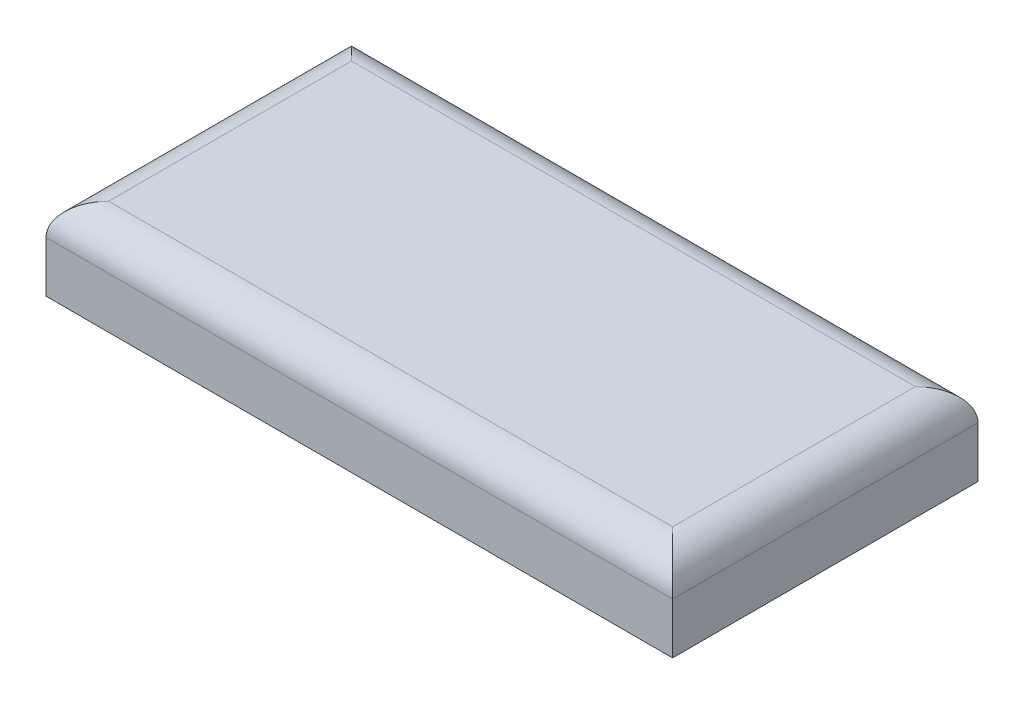
ISO-10303-21;
HEADER;
FILE_DESCRIPTION(('STEP AP214'),'2;1');
FILE_NAME('part.step','',(''),(''),'','','');
FILE_SCHEMA(('AUTOMOTIVE_DESIGN { 1 0 10303 214 1 1 1 1 }'));
ENDSEC;
DATA;
#1=APPLICATION_CONTEXT('core data for automotive mechanical design processes');
#2=APPLICATION_PROTOCOL_DEFINITION('international standard','automotive_design',2000,#1);
#3=PRODUCT_CONTEXT('',#1,'mechanical');
#4=PRODUCT('Part','Part','',(#3));
#5=PRODUCT_RELATED_PRODUCT_CATEGORY('part','',(#4));
#6=PRODUCT_DEFINITION_FORMATION('','',#4);
#7=PRODUCT_DEFINITION_CONTEXT('part definition',#1,'design');
#8=PRODUCT_DEFINITION('design','',#6,#7);
#9=PRODUCT_DEFINITION_SHAPE('','',#8);
#10=(LENGTH_UNIT() NAMED_UNIT(*) SI_UNIT(.MILLI.,.METRE.));
#11=(NAMED_UNIT(*) PLANE_ANGLE_UNIT() SI_UNIT($,.RADIAN.));
#12=(NAMED_UNIT(*) SI_UNIT($,.STERADIAN.) SOLID_ANGLE_UNIT());
#13=UNCERTAINTY_MEASURE_WITH_UNIT(LENGTH_MEASURE(1.E-05),#10,'distance_accuracy_value','');
#14=(GEOMETRIC_REPRESENTATION_CONTEXT(3) GLOBAL_UNCERTAINTY_ASSIGNED_CONTEXT((#13)) GLOBAL_UNIT_ASSIGNED_CONTEXT((#10,
#11,#12)) REPRESENTATION_CONTEXT('',''));
#15=CARTESIAN_POINT('',(0.,0.,0.));
#16=DIRECTION('',(0.,0.,1.));
#17=DIRECTION('',(1.,0.,0.));
#18=AXIS2_PLACEMENT_3D('',#15,#16,#17);
#19=CARTESIAN_POINT('',(39.25,1.,-18.75));
#20=DIRECTION('',(0.,0.,-1.));
#21=DIRECTION('',(-1.,0.,0.));
#22=AXIS2_PLACEMENT_3D('',#19,#20,#21);
#23=PLANE('',#22);
#24=DIRECTION('',(1.,0.,0.));
#25=VECTOR('',#24,1.);
#26=CARTESIAN_POINT('',(39.25,0.,-18.75));
#27=LINE('',#26,#25);
#28=CARTESIAN_POINT('',(-39.25,0.,-18.75));
#29=VERTEX_POINT('',#28);
#30=CARTESIAN_POINT('',(-38.5,0.,-18.75));
#31=VERTEX_POINT('',#30);
#32=EDGE_CURVE('E245',#29,#31,#27,.T.);
#33=ORIENTED_EDGE('',*,*,#32,.T.);
#34=DIRECTION('',(0.,-1.,0.));
#35=VECTOR('',#34,1.);
#36=CARTESIAN_POINT('',(-38.5,-3.,-18.75));
#37=LINE('',#36,#35);
#38=CARTESIAN_POINT('',(-38.5,1.,-18.75));
#39=VERTEX_POINT('',#38);
#40=EDGE_CURVE('E228',#39,#31,#37,.T.);
#41=ORIENTED_EDGE('',*,*,#40,.F.);
#42=DIRECTION('',(1.,0.,0.));
#43=VECTOR('',#42,1.);
#44=CARTESIAN_POINT('',(39.25,1.,-18.75));
#45=LINE('',#44,#43);
#46=CARTESIAN_POINT('',(-39.25,1.,-18.75));
#47=VERTEX_POINT('',#46);
#48=EDGE_CURVE('E362',#47,#39,#45,.T.);
#49=ORIENTED_EDGE('',*,*,#48,.F.);
#50=DIRECTION('',(0.,-1.,0.));
#51=VECTOR('',#50,1.);
#52=CARTESIAN_POINT('',(-39.25,1.,-18.75));
#53=LINE('',#52,#51);
#54=EDGE_CURVE('E267',#47,#29,#53,.T.);
#55=ORIENTED_EDGE('',*,*,#54,.T.);
#56=EDGE_LOOP('',(#33,#41,#49,#55));
#57=FACE_BOUND('',#56,.T.);
#58=ADVANCED_FACE('F33',(#57),#23,.F.);
#59=CARTESIAN_POINT('',(0.,0.,0.));
#60=DIRECTION('',(0.,1.,0.));
#61=DIRECTION('',(0.,0.,1.));
#62=AXIS2_PLACEMENT_3D('',#59,#60,#61);
#63=PLANE('',#62);
#64=DIRECTION('',(-1.,0.,0.));
#65=VECTOR('',#64,1.);
#66=CARTESIAN_POINT('',(40.,0.,-19.5));
#67=LINE('',#66,#65);
#68=CARTESIAN_POINT('',(-38.5,0.,-19.5));
#69=VERTEX_POINT('',#68);
#70=CARTESIAN_POINT('',(-40.,0.,-19.5));
#71=VERTEX_POINT('',#70);
#72=EDGE_CURVE('E195',#69,#71,#67,.T.);
#73=ORIENTED_EDGE('',*,*,#72,.F.);
#74=DIRECTION('',(0.,0.,-1.));
#75=VECTOR('',#74,1.);
#76=CARTESIAN_POINT('',(-38.5,0.,19.501));
#77=LINE('',#76,#75);
#78=EDGE_CURVE('E187',#31,#69,#77,.T.);
#79=ORIENTED_EDGE('',*,*,#78,.F.);
#80=ORIENTED_EDGE('',*,*,#32,.F.);
#81=DIRECTION('',(0.,0.,-1.));
#82=VECTOR('',#81,1.);
#83=CARTESIAN_POINT('',(-39.25,0.,-18.75));
#84=LINE('',#83,#82);
#85=CARTESIAN_POINT('',(-39.25,0.,18.75));
#86=VERTEX_POINT('',#85);
#87=EDGE_CURVE('E236',#86,#29,#84,.T.);
#88=ORIENTED_EDGE('',*,*,#87,.F.);
#89=DIRECTION('',(-1.,0.,0.));
#90=VECTOR('',#89,1.);
#91=CARTESIAN_POINT('',(39.25,0.,18.75));
#92=LINE('',#91,#90);
#93=CARTESIAN_POINT('',(39.25,0.,18.75));
#94=VERTEX_POINT('',#93);
#95=EDGE_CURVE('E255',#94,#86,#92,.T.);
#96=ORIENTED_EDGE('',*,*,#95,.F.);
#97=DIRECTION('',(0.,0.,1.));
#98=VECTOR('',#97,1.);
#99=CARTESIAN_POINT('',(39.25,0.,-18.75));
#100=LINE('',#99,#98);
#101=CARTESIAN_POINT('',(39.25,0.,-18.75));
#102=VERTEX_POINT('',#101);
#103=EDGE_CURVE('E252',#102,#94,#100,.T.);
#104=ORIENTED_EDGE('',*,*,#103,.F.);
#105=CARTESIAN_POINT('',(-34.5,0.,-18.75));
#106=VERTEX_POINT('',#105);
#107=EDGE_CURVE('E185',#106,#102,#27,.T.);
#108=ORIENTED_EDGE('',*,*,#107,.F.);
#109=DIRECTION('',(0.,0.,1.));
#110=VECTOR('',#109,1.);
#111=CARTESIAN_POINT('',(-34.5,0.,19.501));
#112=LINE('',#111,#110);
#113=CARTESIAN_POINT('',(-34.5,0.,-19.5));
#114=VERTEX_POINT('',#113);
#115=EDGE_CURVE('E167',#114,#106,#112,.T.);
#116=ORIENTED_EDGE('',*,*,#115,.F.);
#117=CARTESIAN_POINT('',(40.,0.,-19.5));
#118=VERTEX_POINT('',#117);
#119=EDGE_CURVE('E183',#118,#114,#67,.T.);
#120=ORIENTED_EDGE('',*,*,#119,.F.);
#121=DIRECTION('',(0.,0.,-1.));
#122=VECTOR('',#121,1.);
#123=CARTESIAN_POINT('',(40.,0.,19.5));
#124=LINE('',#123,#122);
#125=CARTESIAN_POINT('',(40.,0.,19.5));
#126=VERTEX_POINT('',#125);
#127=EDGE_CURVE('E199',#126,#118,#124,.T.);
#128=ORIENTED_EDGE('',*,*,#127,.F.);
#129=DIRECTION('',(1.,0.,0.));
#130=VECTOR('',#129,1.);
#131=CARTESIAN_POINT('',(40.,0.,19.5));
#132=LINE('',#131,#130);
#133=CARTESIAN_POINT('',(-40.,0.,19.5));
#134=VERTEX_POINT('',#133);
#135=EDGE_CURVE('E301',#134,#126,#132,.T.);
#136=ORIENTED_EDGE('',*,*,#135,.F.);
#137=DIRECTION('',(0.,0.,1.));
#138=VECTOR('',#137,1.);
#139=CARTESIAN_POINT('',(-40.,0.,19.5));
#140=LINE('',#139,#138);
#141=EDGE_CURVE('E299',#71,#134,#140,.T.);
#142=ORIENTED_EDGE('',*,*,#141,.F.);
#143=EDGE_LOOP('',(#73,#79,#80,#88,#96,#104,#108,#116,#120,#128,#136,#142));
#144=FACE_BOUND('',#143,.T.);
#145=ADVANCED_FACE('F181',(#144),#63,.F.);
#146=CARTESIAN_POINT('',(-40.,9.,19.5));
#147=DIRECTION('',(1.,0.,0.));
#148=DIRECTION('',(0.,0.,-1.));
#149=AXIS2_PLACEMENT_3D('',#146,#147,#148);
#150=PLANE('',#149);
#151=DIRECTION('',(0.,-1.,0.));
#152=VECTOR('',#151,1.);
#153=CARTESIAN_POINT('',(-40.,9.,19.5));
#154=LINE('',#153,#152);
#155=CARTESIAN_POINT('',(-40.,6.5,19.5));
#156=VERTEX_POINT('',#155);
#157=EDGE_CURVE('E206',#156,#134,#154,.T.);
#158=ORIENTED_EDGE('',*,*,#157,.F.);
#159=DIRECTION('',(0.,0.,1.));
#160=VECTOR('',#159,1.);
#161=CARTESIAN_POINT('',(-40.,6.5,19.5));
#162=LINE('',#161,#160);
#163=CARTESIAN_POINT('',(-40.,6.5,-19.5));
#164=VERTEX_POINT('',#163);
#165=EDGE_CURVE('E11',#156,#164,#162,.F.);
#166=ORIENTED_EDGE('',*,*,#165,.T.);
#167=DIRECTION('',(0.,-1.,0.));
#168=VECTOR('',#167,1.);
#169=CARTESIAN_POINT('',(-40.,9.,-19.5));
#170=LINE('',#169,#168);
#171=EDGE_CURVE('E194',#164,#71,#170,.T.);
#172=ORIENTED_EDGE('',*,*,#171,.T.);
#173=ORIENTED_EDGE('',*,*,#141,.T.);
#174=EDGE_LOOP('',(#158,#166,#172,#173));
#175=FACE_BOUND('',#174,.T.);
#176=ADVANCED_FACE('F308',(#175),#150,.F.);
#177=CARTESIAN_POINT('',(40.,9.,19.5));
#178=DIRECTION('',(0.,0.,-1.));
#179=DIRECTION('',(-1.,0.,0.));
#180=AXIS2_PLACEMENT_3D('',#177,#178,#179);
#181=PLANE('',#180);
#182=DIRECTION('',(0.,-1.,0.));
#183=VECTOR('',#182,1.);
#184=CARTESIAN_POINT('',(40.,9.,19.5));
#185=LINE('',#184,#183);
#186=CARTESIAN_POINT('',(40.,6.5,19.5));
#187=VERTEX_POINT('',#186);
#188=EDGE_CURVE('E204',#187,#126,#185,.T.);
#189=ORIENTED_EDGE('',*,*,#188,.F.);
#190=DIRECTION('',(1.,0.,0.));
#191=VECTOR('',#190,1.);
#192=CARTESIAN_POINT('',(40.,6.5,19.5));
#193=LINE('',#192,#191);
#194=EDGE_CURVE('E42',#187,#156,#193,.F.);
#195=ORIENTED_EDGE('',*,*,#194,.T.);
#196=ORIENTED_EDGE('',*,*,#157,.T.);
#197=ORIENTED_EDGE('',*,*,#135,.T.);
#198=EDGE_LOOP('',(#189,#195,#196,#197));
#199=FACE_BOUND('',#198,.T.);
#200=ADVANCED_FACE('F322',(#199),#181,.F.);
#201=CARTESIAN_POINT('',(40.,9.,19.5));
#202=DIRECTION('',(-1.,0.,0.));
#203=DIRECTION('',(0.,0.,1.));
#204=AXIS2_PLACEMENT_3D('',#201,#202,#203);
#205=PLANE('',#204);
#206=DIRECTION('',(0.,-1.,0.));
#207=VECTOR('',#206,1.);
#208=CARTESIAN_POINT('',(40.,9.,-19.5));
#209=LINE('',#208,#207);
#210=CARTESIAN_POINT('',(40.,6.5,-19.5));
#211=VERTEX_POINT('',#210);
#212=EDGE_CURVE('E192',#211,#118,#209,.T.);
#213=ORIENTED_EDGE('',*,*,#212,.F.);
#214=DIRECTION('',(0.,0.,-1.));
#215=VECTOR('',#214,1.);
#216=CARTESIAN_POINT('',(40.,6.5,19.5));
#217=LINE('',#216,#215);
#218=EDGE_CURVE('E222',#211,#187,#217,.F.);
#219=ORIENTED_EDGE('',*,*,#218,.T.);
#220=ORIENTED_EDGE('',*,*,#188,.T.);
#221=ORIENTED_EDGE('',*,*,#127,.T.);
#222=EDGE_LOOP('',(#213,#219,#220,#221));
#223=FACE_BOUND('',#222,.T.);
#224=ADVANCED_FACE('F305',(#223),#205,.F.);
#225=CARTESIAN_POINT('',(40.,9.,-19.5));
#226=DIRECTION('',(0.,0.,1.));
#227=DIRECTION('',(1.,0.,0.));
#228=AXIS2_PLACEMENT_3D('',#225,#226,#227);
#229=PLANE('',#228);
#230=CARTESIAN_POINT('',(-36.5,3.,-19.5));
#231=DIRECTION('',(0.,0.,-1.));
#232=DIRECTION('',(-1.,0.,0.));
#233=AXIS2_PLACEMENT_3D('',#230,#231,#232);
#234=CIRCLE('',#233,2.);
#235=CARTESIAN_POINT('',(-38.5,3.,-19.5));
#236=VERTEX_POINT('',#235);
#237=CARTESIAN_POINT('',(-34.5,3.,-19.5));
#238=VERTEX_POINT('',#237);
#239=EDGE_CURVE('E175',#236,#238,#234,.T.);
#240=ORIENTED_EDGE('',*,*,#239,.F.);
#241=DIRECTION('',(0.,1.,0.));
#242=VECTOR('',#241,1.);
#243=CARTESIAN_POINT('',(-38.5,-3.,-19.5));
#244=LINE('',#243,#242);
#245=EDGE_CURVE('E393',#69,#236,#244,.T.);
#246=ORIENTED_EDGE('',*,*,#245,.F.);
#247=ORIENTED_EDGE('',*,*,#72,.T.);
#248=ORIENTED_EDGE('',*,*,#171,.F.);
#249=DIRECTION('',(-1.,0.,0.));
#250=VECTOR('',#249,1.);
#251=CARTESIAN_POINT('',(40.,6.5,-19.5));
#252=LINE('',#251,#250);
#253=EDGE_CURVE('E220',#164,#211,#252,.F.);
#254=ORIENTED_EDGE('',*,*,#253,.T.);
#255=ORIENTED_EDGE('',*,*,#212,.T.);
#256=ORIENTED_EDGE('',*,*,#119,.T.);
#257=DIRECTION('',(0.,-1.,0.));
#258=VECTOR('',#257,1.);
#259=CARTESIAN_POINT('',(-34.5,-3.,-19.5));
#260=LINE('',#259,#258);
#261=EDGE_CURVE('E164',#238,#114,#260,.T.);
#262=ORIENTED_EDGE('',*,*,#261,.F.);
#263=EDGE_LOOP('',(#240,#246,#247,#248,#254,#255,#256,#262));
#264=FACE_BOUND('',#263,.T.);
#265=ADVANCED_FACE('F189',(#264),#229,.F.);
#266=CARTESIAN_POINT('',(0.,10.5,0.));
#267=DIRECTION('',(0.,-1.,0.));
#268=DIRECTION('',(0.,0.,-1.));
#269=AXIS2_PLACEMENT_3D('',#266,#267,#268);
#270=PLANE('',#269);
#271=DIRECTION('',(0.,0.,-1.));
#272=VECTOR('',#271,1.);
#273=CARTESIAN_POINT('',(36.,10.5,0.));
#274=LINE('',#273,#272);
#275=CARTESIAN_POINT('',(36.,10.5,15.5));
#276=VERTEX_POINT('',#275);
#277=CARTESIAN_POINT('',(36.,10.5,-15.5));
#278=VERTEX_POINT('',#277);
#279=EDGE_CURVE('E215',#276,#278,#274,.T.);
#280=ORIENTED_EDGE('',*,*,#279,.T.);
#281=DIRECTION('',(-1.,0.,0.));
#282=VECTOR('',#281,1.);
#283=CARTESIAN_POINT('',(0.,10.5,-15.5));
#284=LINE('',#283,#282);
#285=CARTESIAN_POINT('',(-36.,10.5,-15.5));
#286=VERTEX_POINT('',#285);
#287=EDGE_CURVE('E217',#278,#286,#284,.T.);
#288=ORIENTED_EDGE('',*,*,#287,.T.);
#289=DIRECTION('',(0.,0.,1.));
#290=VECTOR('',#289,1.);
#291=CARTESIAN_POINT('',(-36.,10.5,0.));
#292=LINE('',#291,#290);
#293=CARTESIAN_POINT('',(-36.,10.5,15.5));
#294=VERTEX_POINT('',#293);
#295=EDGE_CURVE('E211',#286,#294,#292,.T.);
#296=ORIENTED_EDGE('',*,*,#295,.T.);
#297=DIRECTION('',(1.,0.,0.));
#298=VECTOR('',#297,1.);
#299=CARTESIAN_POINT('',(0.,10.5,15.5));
#300=LINE('',#299,#298);
#301=EDGE_CURVE('E213',#294,#276,#300,.T.);
#302=ORIENTED_EDGE('',*,*,#301,.T.);
#303=EDGE_LOOP('',(#280,#288,#296,#302));
#304=FACE_BOUND('',#303,.T.);
#305=ADVANCED_FACE('F320',(#304),#270,.F.);
#306=CARTESIAN_POINT('',(-39.25,1.,-18.75));
#307=DIRECTION('',(-1.,0.,0.));
#308=DIRECTION('',(0.,0.,1.));
#309=AXIS2_PLACEMENT_3D('',#306,#307,#308);
#310=PLANE('',#309);
#311=ORIENTED_EDGE('',*,*,#87,.T.);
#312=ORIENTED_EDGE('',*,*,#54,.F.);
#313=DIRECTION('',(0.,0.,-1.));
#314=VECTOR('',#313,1.);
#315=CARTESIAN_POINT('',(-39.25,1.,-18.75));
#316=LINE('',#315,#314);
#317=CARTESIAN_POINT('',(-39.25,1.,18.75));
#318=VERTEX_POINT('',#317);
#319=EDGE_CURVE('E258',#318,#47,#316,.T.);
#320=ORIENTED_EDGE('',*,*,#319,.F.);
#321=DIRECTION('',(0.,-1.,0.));
#322=VECTOR('',#321,1.);
#323=CARTESIAN_POINT('',(-39.25,1.,18.75));
#324=LINE('',#323,#322);
#325=EDGE_CURVE('E259',#318,#86,#324,.T.);
#326=ORIENTED_EDGE('',*,*,#325,.T.);
#327=EDGE_LOOP('',(#311,#312,#320,#326));
#328=FACE_BOUND('',#327,.T.);
#329=ADVANCED_FACE('F374',(#328),#310,.F.);
#330=CARTESIAN_POINT('',(39.25,1.,18.75));
#331=DIRECTION('',(0.,0.,1.));
#332=DIRECTION('',(1.,0.,0.));
#333=AXIS2_PLACEMENT_3D('',#330,#331,#332);
#334=PLANE('',#333);
#335=ORIENTED_EDGE('',*,*,#95,.T.);
#336=ORIENTED_EDGE('',*,*,#325,.F.);
#337=DIRECTION('',(-1.,0.,0.));
#338=VECTOR('',#337,1.);
#339=CARTESIAN_POINT('',(39.25,1.,18.75));
#340=LINE('',#339,#338);
#341=CARTESIAN_POINT('',(39.25,1.,18.75));
#342=VERTEX_POINT('',#341);
#343=EDGE_CURVE('E248',#342,#318,#340,.T.);
#344=ORIENTED_EDGE('',*,*,#343,.F.);
#345=DIRECTION('',(0.,-1.,0.));
#346=VECTOR('',#345,1.);
#347=CARTESIAN_POINT('',(39.25,1.,18.75));
#348=LINE('',#347,#346);
#349=EDGE_CURVE('E262',#342,#94,#348,.T.);
#350=ORIENTED_EDGE('',*,*,#349,.T.);
#351=EDGE_LOOP('',(#335,#336,#344,#350));
#352=FACE_BOUND('',#351,.T.);
#353=ADVANCED_FACE('F354',(#352),#334,.F.);
#354=CARTESIAN_POINT('',(39.25,1.,-18.75));
#355=DIRECTION('',(1.,0.,0.));
#356=DIRECTION('',(0.,0.,-1.));
#357=AXIS2_PLACEMENT_3D('',#354,#355,#356);
#358=PLANE('',#357);
#359=ORIENTED_EDGE('',*,*,#103,.T.);
#360=ORIENTED_EDGE('',*,*,#349,.F.);
#361=DIRECTION('',(0.,0.,1.));
#362=VECTOR('',#361,1.);
#363=CARTESIAN_POINT('',(39.25,1.,-18.75));
#364=LINE('',#363,#362);
#365=CARTESIAN_POINT('',(39.25,1.,-18.75));
#366=VERTEX_POINT('',#365);
#367=EDGE_CURVE('E365',#366,#342,#364,.T.);
#368=ORIENTED_EDGE('',*,*,#367,.F.);
#369=DIRECTION('',(0.,-1.,0.));
#370=VECTOR('',#369,1.);
#371=CARTESIAN_POINT('',(39.25,1.,-18.75));
#372=LINE('',#371,#370);
#373=EDGE_CURVE('E264',#366,#102,#372,.T.);
#374=ORIENTED_EDGE('',*,*,#373,.T.);
#375=EDGE_LOOP('',(#359,#360,#368,#374));
#376=FACE_BOUND('',#375,.T.);
#377=ADVANCED_FACE('F345',(#376),#358,.F.);
#378=CARTESIAN_POINT('',(-34.5,1.,-18.75));
#379=VERTEX_POINT('',#378);
#380=EDGE_CURVE('E358',#379,#366,#45,.T.);
#381=ORIENTED_EDGE('',*,*,#380,.F.);
#382=DIRECTION('',(0.,1.,0.));
#383=VECTOR('',#382,1.);
#384=CARTESIAN_POINT('',(-34.5,-3.,-18.75));
#385=LINE('',#384,#383);
#386=EDGE_CURVE('E359',#106,#379,#385,.T.);
#387=ORIENTED_EDGE('',*,*,#386,.F.);
#388=ORIENTED_EDGE('',*,*,#107,.T.);
#389=ORIENTED_EDGE('',*,*,#373,.F.);
#390=EDGE_LOOP('',(#381,#387,#388,#389));
#391=FACE_BOUND('',#390,.T.);
#392=ADVANCED_FACE('F336',(#391),#23,.F.);
#393=CARTESIAN_POINT('',(0.,1.,0.));
#394=DIRECTION('',(0.,-1.,0.));
#395=DIRECTION('',(0.,0.,-1.));
#396=AXIS2_PLACEMENT_3D('',#393,#394,#395);
#397=PLANE('',#396);
#398=ORIENTED_EDGE('',*,*,#48,.T.);
#399=DIRECTION('',(0.,0.,-1.));
#400=VECTOR('',#399,1.);
#401=CARTESIAN_POINT('',(-38.5,0.999999999999999,18.));
#402=LINE('',#401,#400);
#403=CARTESIAN_POINT('',(-38.5,0.999999999999999,18.));
#404=VERTEX_POINT('',#403);
#405=EDGE_CURVE('E261',#404,#39,#402,.T.);
#406=ORIENTED_EDGE('',*,*,#405,.F.);
#407=DIRECTION('',(-1.,0.,0.));
#408=VECTOR('',#407,1.);
#409=CARTESIAN_POINT('',(-38.5,0.999999999999999,18.));
#410=LINE('',#409,#408);
#411=CARTESIAN_POINT('',(38.5,0.999999999999999,18.));
#412=VERTEX_POINT('',#411);
#413=EDGE_CURVE('E208',#412,#404,#410,.T.);
#414=ORIENTED_EDGE('',*,*,#413,.F.);
#415=DIRECTION('',(0.,0.,1.));
#416=VECTOR('',#415,1.);
#417=CARTESIAN_POINT('',(38.5,0.999999999999999,18.));
#418=LINE('',#417,#416);
#419=CARTESIAN_POINT('',(38.5,0.999999999999999,-18.));
#420=VERTEX_POINT('',#419);
#421=EDGE_CURVE('E272',#420,#412,#418,.T.);
#422=ORIENTED_EDGE('',*,*,#421,.F.);
#423=DIRECTION('',(1.,0.,0.));
#424=VECTOR('',#423,1.);
#425=CARTESIAN_POINT('',(-38.5,0.999999999999999,-18.));
#426=LINE('',#425,#424);
#427=CARTESIAN_POINT('',(-34.5,0.999999999999999,-18.));
#428=VERTEX_POINT('',#427);
#429=EDGE_CURVE('E270',#428,#420,#426,.T.);
#430=ORIENTED_EDGE('',*,*,#429,.F.);
#431=DIRECTION('',(0.,0.,-1.));
#432=VECTOR('',#431,1.);
#433=CARTESIAN_POINT('',(-34.5,1.,19.501));
#434=LINE('',#433,#432);
#435=EDGE_CURVE('E50',#428,#379,#434,.T.);
#436=ORIENTED_EDGE('',*,*,#435,.T.);
#437=ORIENTED_EDGE('',*,*,#380,.T.);
#438=ORIENTED_EDGE('',*,*,#367,.T.);
#439=ORIENTED_EDGE('',*,*,#343,.T.);
#440=ORIENTED_EDGE('',*,*,#319,.T.);
#441=EDGE_LOOP('',(#398,#406,#414,#422,#430,#436,#437,#438,#439,#440));
#442=FACE_BOUND('',#441,.T.);
#443=ADVANCED_FACE('F344',(#442),#397,.T.);
#444=CARTESIAN_POINT('',(0.,9.,0.));
#445=DIRECTION('',(0.,-1.,0.));
#446=DIRECTION('',(0.,0.,-1.));
#447=AXIS2_PLACEMENT_3D('',#444,#445,#446);
#448=PLANE('',#447);
#449=DIRECTION('',(-1.,0.,0.));
#450=VECTOR('',#449,1.);
#451=CARTESIAN_POINT('',(-38.5,9.,-18.));
#452=LINE('',#451,#450);
#453=CARTESIAN_POINT('',(38.5,9.,-18.));
#454=VERTEX_POINT('',#453);
#455=CARTESIAN_POINT('',(-38.5,9.,-18.));
#456=VERTEX_POINT('',#455);
#457=EDGE_CURVE('E278',#454,#456,#452,.T.);
#458=ORIENTED_EDGE('',*,*,#457,.F.);
#459=DIRECTION('',(0.,0.,-1.));
#460=VECTOR('',#459,1.);
#461=CARTESIAN_POINT('',(38.5,9.,18.));
#462=LINE('',#461,#460);
#463=CARTESIAN_POINT('',(38.5,9.,18.));
#464=VERTEX_POINT('',#463);
#465=EDGE_CURVE('E275',#464,#454,#462,.T.);
#466=ORIENTED_EDGE('',*,*,#465,.F.);
#467=DIRECTION('',(1.,0.,0.));
#468=VECTOR('',#467,1.);
#469=CARTESIAN_POINT('',(-38.5,9.,18.));
#470=LINE('',#469,#468);
#471=CARTESIAN_POINT('',(-38.5,9.,18.));
#472=VERTEX_POINT('',#471);
#473=EDGE_CURVE('E284',#472,#464,#470,.T.);
#474=ORIENTED_EDGE('',*,*,#473,.F.);
#475=DIRECTION('',(0.,0.,1.));
#476=VECTOR('',#475,1.);
#477=CARTESIAN_POINT('',(-38.5,9.,18.));
#478=LINE('',#477,#476);
#479=EDGE_CURVE('E281',#456,#472,#478,.T.);
#480=ORIENTED_EDGE('',*,*,#479,.F.);
#481=EDGE_LOOP('',(#458,#466,#474,#480));
#482=FACE_BOUND('',#481,.T.);
#483=ADVANCED_FACE('F351',(#482),#448,.T.);
#484=CARTESIAN_POINT('',(-38.5,9.,18.));
#485=DIRECTION('',(0.,0.,-1.));
#486=DIRECTION('',(-1.,0.,0.));
#487=AXIS2_PLACEMENT_3D('',#484,#485,#486);
#488=PLANE('',#487);
#489=DIRECTION('',(0.,-1.,0.));
#490=VECTOR('',#489,1.);
#491=CARTESIAN_POINT('',(38.5,9.,18.));
#492=LINE('',#491,#490);
#493=EDGE_CURVE('E287',#464,#412,#492,.T.);
#494=ORIENTED_EDGE('',*,*,#493,.T.);
#495=ORIENTED_EDGE('',*,*,#413,.T.);
#496=DIRECTION('',(0.,-1.,0.));
#497=VECTOR('',#496,1.);
#498=CARTESIAN_POINT('',(-38.5,9.,18.));
#499=LINE('',#498,#497);
#500=EDGE_CURVE('E290',#472,#404,#499,.T.);
#501=ORIENTED_EDGE('',*,*,#500,.F.);
#502=ORIENTED_EDGE('',*,*,#473,.T.);
#503=EDGE_LOOP('',(#494,#495,#501,#502));
#504=FACE_BOUND('',#503,.T.);
#505=ADVANCED_FACE('F382',(#504),#488,.T.);
#506=CARTESIAN_POINT('',(-38.5,9.,18.));
#507=DIRECTION('',(1.,0.,0.));
#508=DIRECTION('',(0.,0.,-1.));
#509=AXIS2_PLACEMENT_3D('',#506,#507,#508);
#510=PLANE('',#509);
#511=ORIENTED_EDGE('',*,*,#500,.T.);
#512=ORIENTED_EDGE('',*,*,#405,.T.);
#513=ORIENTED_EDGE('',*,*,#40,.T.);
#514=ORIENTED_EDGE('',*,*,#78,.T.);
#515=ORIENTED_EDGE('',*,*,#245,.T.);
#516=DIRECTION('',(0.,0.,-1.));
#517=VECTOR('',#516,1.);
#518=CARTESIAN_POINT('',(-38.5,3.,19.501));
#519=LINE('',#518,#517);
#520=CARTESIAN_POINT('',(-38.5,3.,-18.));
#521=VERTEX_POINT('',#520);
#522=EDGE_CURVE('E174',#521,#236,#519,.T.);
#523=ORIENTED_EDGE('',*,*,#522,.F.);
#524=DIRECTION('',(0.,-1.,0.));
#525=VECTOR('',#524,1.);
#526=CARTESIAN_POINT('',(-38.5,9.,-18.));
#527=LINE('',#526,#525);
#528=EDGE_CURVE('E293',#456,#521,#527,.T.);
#529=ORIENTED_EDGE('',*,*,#528,.F.);
#530=ORIENTED_EDGE('',*,*,#479,.T.);
#531=EDGE_LOOP('',(#511,#512,#513,#514,#515,#523,#529,#530));
#532=FACE_BOUND('',#531,.T.);
#533=ADVANCED_FACE('F384',(#532),#510,.T.);
#534=CARTESIAN_POINT('',(-38.5,9.,-18.));
#535=DIRECTION('',(0.,0.,1.));
#536=DIRECTION('',(1.,0.,0.));
#537=AXIS2_PLACEMENT_3D('',#534,#535,#536);
#538=PLANE('',#537);
#539=CARTESIAN_POINT('',(-36.5,3.,-18.));
#540=DIRECTION('',(0.,0.,1.));
#541=DIRECTION('',(1.,0.,0.));
#542=AXIS2_PLACEMENT_3D('',#539,#540,#541);
#543=CIRCLE('',#542,2.);
#544=CARTESIAN_POINT('',(-34.5,3.,-18.));
#545=VERTEX_POINT('',#544);
#546=EDGE_CURVE('E186',#521,#545,#543,.F.);
#547=ORIENTED_EDGE('',*,*,#546,.T.);
#548=DIRECTION('',(0.,-1.,0.));
#549=VECTOR('',#548,1.);
#550=CARTESIAN_POINT('',(-34.5,-3.,-18.));
#551=LINE('',#550,#549);
#552=EDGE_CURVE('E391',#545,#428,#551,.T.);
#553=ORIENTED_EDGE('',*,*,#552,.T.);
#554=ORIENTED_EDGE('',*,*,#429,.T.);
#555=DIRECTION('',(0.,-1.,0.));
#556=VECTOR('',#555,1.);
#557=CARTESIAN_POINT('',(38.5,9.,-18.));
#558=LINE('',#557,#556);
#559=EDGE_CURVE('E296',#454,#420,#558,.T.);
#560=ORIENTED_EDGE('',*,*,#559,.F.);
#561=ORIENTED_EDGE('',*,*,#457,.T.);
#562=ORIENTED_EDGE('',*,*,#528,.T.);
#563=EDGE_LOOP('',(#547,#553,#554,#560,#561,#562));
#564=FACE_BOUND('',#563,.T.);
#565=ADVANCED_FACE('F330',(#564),#538,.T.);
#566=CARTESIAN_POINT('',(38.5,9.,18.));
#567=DIRECTION('',(-1.,0.,0.));
#568=DIRECTION('',(0.,0.,1.));
#569=AXIS2_PLACEMENT_3D('',#566,#567,#568);
#570=PLANE('',#569);
#571=ORIENTED_EDGE('',*,*,#559,.T.);
#572=ORIENTED_EDGE('',*,*,#421,.T.);
#573=ORIENTED_EDGE('',*,*,#493,.F.);
#574=ORIENTED_EDGE('',*,*,#465,.T.);
#575=EDGE_LOOP('',(#571,#572,#573,#574));
#576=FACE_BOUND('',#575,.T.);
#577=ADVANCED_FACE('F325',(#576),#570,.T.);
#578=CARTESIAN_POINT('',(0.,6.5,15.5));
#579=DIRECTION('',(1.,0.,0.));
#580=DIRECTION('',(0.,0.,-1.));
#581=AXIS2_PLACEMENT_3D('',#578,#579,#580);
#582=CYLINDRICAL_SURFACE('',#581,4.);
#583=CARTESIAN_POINT('',(-36.,6.5,15.5));
#584=DIRECTION('',(0.707106781186547,0.,0.707106781186547));
#585=DIRECTION('',(-0.707106781186547,0.,0.707106781186547));
#586=AXIS2_PLACEMENT_3D('',#583,#584,#585);
#587=ELLIPSE('',#586,5.65685424949238,4.);
#588=EDGE_CURVE('E229',#156,#294,#587,.F.);
#589=ORIENTED_EDGE('',*,*,#588,.F.);
#590=ORIENTED_EDGE('',*,*,#194,.F.);
#591=CARTESIAN_POINT('',(36.,6.5,15.5));
#592=DIRECTION('',(0.707106781186547,0.,-0.707106781186547));
#593=DIRECTION('',(0.707106781186547,0.,0.707106781186547));
#594=AXIS2_PLACEMENT_3D('',#591,#592,#593);
#595=ELLIPSE('',#594,5.65685424949238,4.);
#596=EDGE_CURVE('E37',#276,#187,#595,.T.);
#597=ORIENTED_EDGE('',*,*,#596,.F.);
#598=ORIENTED_EDGE('',*,*,#301,.F.);
#599=EDGE_LOOP('',(#589,#590,#597,#598));
#600=FACE_BOUND('',#599,.T.);
#601=ADVANCED_FACE('F35',(#600),#582,.T.);
#602=CARTESIAN_POINT('',(36.,6.5,0.));
#603=DIRECTION('',(0.,0.,-1.));
#604=DIRECTION('',(-1.,0.,0.));
#605=AXIS2_PLACEMENT_3D('',#602,#603,#604);
#606=CYLINDRICAL_SURFACE('',#605,4.);
#607=ORIENTED_EDGE('',*,*,#596,.T.);
#608=ORIENTED_EDGE('',*,*,#218,.F.);
#609=CARTESIAN_POINT('',(36.,6.5,-15.5));
#610=DIRECTION('',(-0.707106781186547,0.,-0.707106781186547));
#611=DIRECTION('',(0.707106781186547,0.,-0.707106781186547));
#612=AXIS2_PLACEMENT_3D('',#609,#610,#611);
#613=ELLIPSE('',#612,5.65685424949238,4.);
#614=EDGE_CURVE('E227',#278,#211,#613,.T.);
#615=ORIENTED_EDGE('',*,*,#614,.F.);
#616=ORIENTED_EDGE('',*,*,#279,.F.);
#617=EDGE_LOOP('',(#607,#608,#615,#616));
#618=FACE_BOUND('',#617,.T.);
#619=ADVANCED_FACE('F321',(#618),#606,.T.);
#620=CARTESIAN_POINT('',(-36.,6.5,0.));
#621=DIRECTION('',(0.,0.,1.));
#622=DIRECTION('',(1.,0.,0.));
#623=AXIS2_PLACEMENT_3D('',#620,#621,#622);
#624=CYLINDRICAL_SURFACE('',#623,4.);
#625=ORIENTED_EDGE('',*,*,#588,.T.);
#626=ORIENTED_EDGE('',*,*,#295,.F.);
#627=CARTESIAN_POINT('',(-36.,6.5,-15.5));
#628=DIRECTION('',(-0.707106781186547,0.,0.707106781186547));
#629=DIRECTION('',(0.707106781186547,0.,0.707106781186547));
#630=AXIS2_PLACEMENT_3D('',#627,#628,#629);
#631=ELLIPSE('',#630,5.65685424949238,4.);
#632=EDGE_CURVE('E225',#164,#286,#631,.F.);
#633=ORIENTED_EDGE('',*,*,#632,.F.);
#634=ORIENTED_EDGE('',*,*,#165,.F.);
#635=EDGE_LOOP('',(#625,#626,#633,#634));
#636=FACE_BOUND('',#635,.T.);
#637=ADVANCED_FACE('F317',(#636),#624,.T.);
#638=CARTESIAN_POINT('',(0.,6.5,-15.5));
#639=DIRECTION('',(-1.,0.,0.));
#640=DIRECTION('',(0.,0.,1.));
#641=AXIS2_PLACEMENT_3D('',#638,#639,#640);
#642=CYLINDRICAL_SURFACE('',#641,4.);
#643=ORIENTED_EDGE('',*,*,#614,.T.);
#644=ORIENTED_EDGE('',*,*,#253,.F.);
#645=ORIENTED_EDGE('',*,*,#632,.T.);
#646=ORIENTED_EDGE('',*,*,#287,.F.);
#647=EDGE_LOOP('',(#643,#644,#645,#646));
#648=FACE_BOUND('',#647,.T.);
#649=ADVANCED_FACE('F314',(#648),#642,.T.);
#650=CARTESIAN_POINT('',(-36.5,3.,19.501));
#651=DIRECTION('',(0.,0.,-1.));
#652=DIRECTION('',(-1.,0.,0.));
#653=AXIS2_PLACEMENT_3D('',#650,#651,#652);
#654=CYLINDRICAL_SURFACE('',#653,2.);
#655=ORIENTED_EDGE('',*,*,#522,.T.);
#656=ORIENTED_EDGE('',*,*,#239,.T.);
#657=DIRECTION('',(0.,0.,-1.));
#658=VECTOR('',#657,1.);
#659=CARTESIAN_POINT('',(-34.5,3.,19.501));
#660=LINE('',#659,#658);
#661=EDGE_CURVE('E169',#545,#238,#660,.T.);
#662=ORIENTED_EDGE('',*,*,#661,.F.);
#663=ORIENTED_EDGE('',*,*,#546,.F.);
#664=EDGE_LOOP('',(#655,#656,#662,#663));
#665=FACE_BOUND('',#664,.T.);
#666=ADVANCED_FACE('F406',(#665),#654,.F.);
#667=CARTESIAN_POINT('',(-34.5,-3.,19.501));
#668=DIRECTION('',(1.,0.,0.));
#669=DIRECTION('',(0.,0.,-1.));
#670=AXIS2_PLACEMENT_3D('',#667,#668,#669);
#671=PLANE('',#670);
#672=ORIENTED_EDGE('',*,*,#115,.T.);
#673=ORIENTED_EDGE('',*,*,#386,.T.);
#674=ORIENTED_EDGE('',*,*,#435,.F.);
#675=ORIENTED_EDGE('',*,*,#552,.F.);
#676=ORIENTED_EDGE('',*,*,#661,.T.);
#677=ORIENTED_EDGE('',*,*,#261,.T.);
#678=EDGE_LOOP('',(#672,#673,#674,#675,#676,#677));
#679=FACE_BOUND('',#678,.T.);
#680=ADVANCED_FACE('F166',(#679),#671,.F.);
#681=CLOSED_SHELL('',(#58,#145,#176,#200,#224,#265,#305,#329,#353,#377,#392,#443,#483,#505,#533,
#565,#577,#601,#619,#637,#649,#666,#680));
#682=MANIFOLD_SOLID_BREP('B2',#681);
#683=ADVANCED_BREP_SHAPE_REPRESENTATION('',(#18,#682),#14);
#684=SHAPE_DEFINITION_REPRESENTATION(#9,#683);
ENDSEC;
END-ISO-10303-21;
